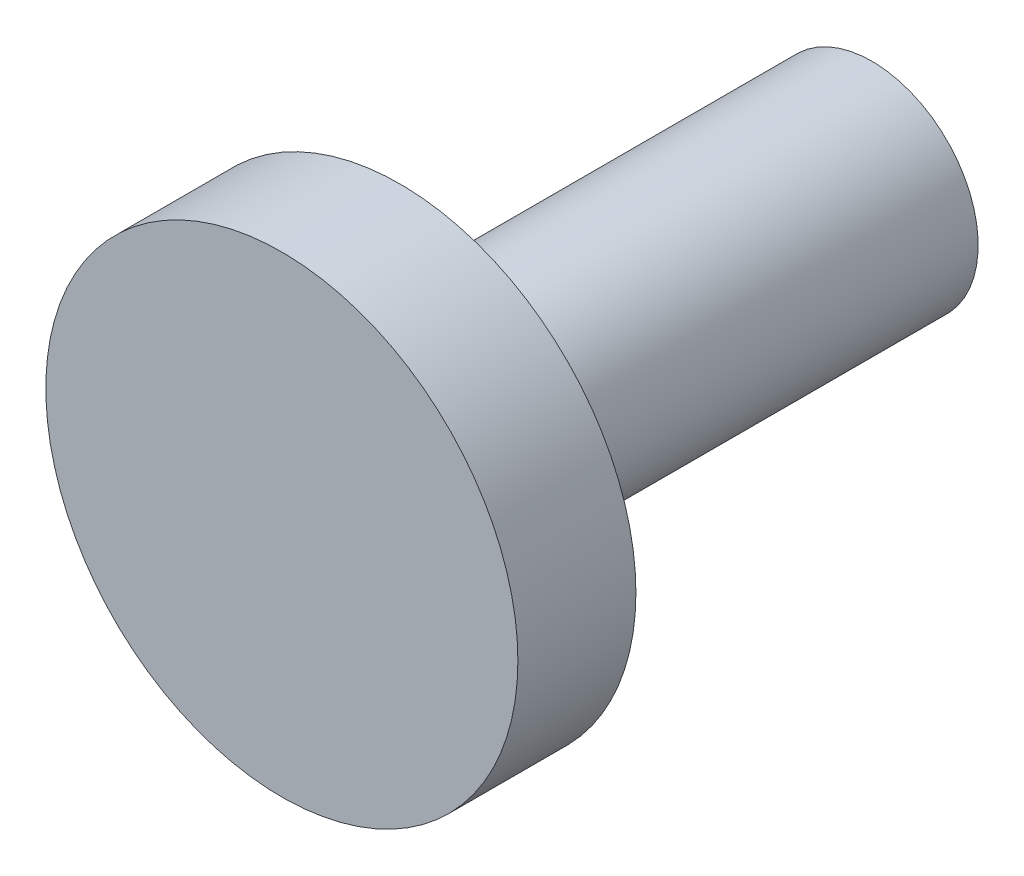
ISO-10303-21;
HEADER;
FILE_DESCRIPTION(('STEP AP214'),'2;1');
FILE_NAME('part.step','',(''),(''),'','','');
FILE_SCHEMA(('AUTOMOTIVE_DESIGN { 1 0 10303 214 1 1 1 1 }'));
ENDSEC;
DATA;
#1=APPLICATION_CONTEXT('core data for automotive mechanical design processes');
#2=APPLICATION_PROTOCOL_DEFINITION('international standard','automotive_design',2000,#1);
#3=PRODUCT_CONTEXT('',#1,'mechanical');
#4=PRODUCT('Part','Part','',(#3));
#5=PRODUCT_RELATED_PRODUCT_CATEGORY('part','',(#4));
#6=PRODUCT_DEFINITION_FORMATION('','',#4);
#7=PRODUCT_DEFINITION_CONTEXT('part definition',#1,'design');
#8=PRODUCT_DEFINITION('design','',#6,#7);
#9=PRODUCT_DEFINITION_SHAPE('','',#8);
#10=(LENGTH_UNIT() NAMED_UNIT(*) SI_UNIT(.MILLI.,.METRE.));
#11=(NAMED_UNIT(*) PLANE_ANGLE_UNIT() SI_UNIT($,.RADIAN.));
#12=(NAMED_UNIT(*) SI_UNIT($,.STERADIAN.) SOLID_ANGLE_UNIT());
#13=UNCERTAINTY_MEASURE_WITH_UNIT(LENGTH_MEASURE(1.E-05),#10,'distance_accuracy_value','');
#14=(GEOMETRIC_REPRESENTATION_CONTEXT(3) GLOBAL_UNCERTAINTY_ASSIGNED_CONTEXT((#13)) GLOBAL_UNIT_ASSIGNED_CONTEXT((#10,
#11,#12)) REPRESENTATION_CONTEXT('',''));
#15=CARTESIAN_POINT('',(0.,0.,0.));
#16=DIRECTION('',(0.,0.,1.));
#17=DIRECTION('',(1.,0.,0.));
#18=AXIS2_PLACEMENT_3D('',#15,#16,#17);
#19=CARTESIAN_POINT('',(0.,0.,2.5));
#20=DIRECTION('',(0.,0.,-1.));
#21=DIRECTION('',(-1.,0.,0.));
#22=AXIS2_PLACEMENT_3D('',#19,#20,#21);
#23=CYLINDRICAL_SURFACE('',#22,5.);
#24=CARTESIAN_POINT('',(0.,0.,2.5));
#25=DIRECTION('',(0.,0.,1.));
#26=DIRECTION('',(1.,0.,0.));
#27=AXIS2_PLACEMENT_3D('',#24,#25,#26);
#28=CIRCLE('',#27,5.);
#29=CARTESIAN_POINT('',(5.,0.,2.5));
#30=VERTEX_POINT('',#29);
#31=EDGE_CURVE('E40',#30,#30,#28,.T.);
#32=ORIENTED_EDGE('',*,*,#31,.F.);
#33=EDGE_LOOP('',(#32));
#34=FACE_BOUND('',#33,.T.);
#35=CARTESIAN_POINT('',(0.,0.,0.));
#36=DIRECTION('',(0.,0.,1.));
#37=DIRECTION('',(1.,0.,0.));
#38=AXIS2_PLACEMENT_3D('',#35,#36,#37);
#39=CIRCLE('',#38,5.);
#40=CARTESIAN_POINT('',(5.,0.,0.));
#41=VERTEX_POINT('',#40);
#42=EDGE_CURVE('E36',#41,#41,#39,.T.);
#43=ORIENTED_EDGE('',*,*,#42,.T.);
#44=EDGE_LOOP('',(#43));
#45=FACE_BOUND('',#44,.T.);
#46=ADVANCED_FACE('F33',(#34,#45),#23,.T.);
#47=CARTESIAN_POINT('',(0.,0.,2.5));
#48=DIRECTION('',(0.,0.,1.));
#49=DIRECTION('',(1.,0.,0.));
#50=AXIS2_PLACEMENT_3D('',#47,#48,#49);
#51=PLANE('',#50);
#52=ORIENTED_EDGE('',*,*,#31,.T.);
#53=EDGE_LOOP('',(#52));
#54=FACE_BOUND('',#53,.T.);
#55=ADVANCED_FACE('F77',(#54),#51,.T.);
#56=CARTESIAN_POINT('',(0.,0.,0.));
#57=DIRECTION('',(0.,0.,1.));
#58=DIRECTION('',(1.,0.,0.));
#59=AXIS2_PLACEMENT_3D('',#56,#57,#58);
#60=PLANE('',#59);
#61=CARTESIAN_POINT('',(0.,0.,0.));
#62=DIRECTION('',(0.,0.,-1.));
#63=DIRECTION('',(-1.,0.,0.));
#64=AXIS2_PLACEMENT_3D('',#61,#62,#63);
#65=CIRCLE('',#64,2.25);
#66=CARTESIAN_POINT('',(-2.25,0.,0.));
#67=VERTEX_POINT('',#66);
#68=EDGE_CURVE('E10',#67,#67,#65,.T.);
#69=ORIENTED_EDGE('',*,*,#68,.F.);
#70=EDGE_LOOP('',(#69));
#71=FACE_BOUND('',#70,.T.);
#72=ORIENTED_EDGE('',*,*,#42,.F.);
#73=EDGE_LOOP('',(#72));
#74=FACE_BOUND('',#73,.T.);
#75=ADVANCED_FACE('F72',(#71,#74),#60,.F.);
#76=CARTESIAN_POINT('',(0.,0.,-10.));
#77=DIRECTION('',(0.,0.,1.));
#78=DIRECTION('',(1.,0.,0.));
#79=AXIS2_PLACEMENT_3D('',#76,#77,#78);
#80=CYLINDRICAL_SURFACE('',#79,2.25);
#81=CARTESIAN_POINT('',(0.,0.,-10.));
#82=DIRECTION('',(0.,0.,-1.));
#83=DIRECTION('',(-1.,0.,0.));
#84=AXIS2_PLACEMENT_3D('',#81,#82,#83);
#85=CIRCLE('',#84,2.25);
#86=CARTESIAN_POINT('',(-2.25,0.,-10.));
#87=VERTEX_POINT('',#86);
#88=EDGE_CURVE('E46',#87,#87,#85,.T.);
#89=ORIENTED_EDGE('',*,*,#88,.F.);
#90=EDGE_LOOP('',(#89));
#91=FACE_BOUND('',#90,.T.);
#92=ORIENTED_EDGE('',*,*,#68,.T.);
#93=EDGE_LOOP('',(#92));
#94=FACE_BOUND('',#93,.T.);
#95=ADVANCED_FACE('F67',(#91,#94),#80,.T.);
#96=CARTESIAN_POINT('',(0.,0.,-10.));
#97=DIRECTION('',(0.,0.,-1.));
#98=DIRECTION('',(-1.,0.,0.));
#99=AXIS2_PLACEMENT_3D('',#96,#97,#98);
#100=PLANE('',#99);
#101=CARTESIAN_POINT('',(0.,0.,-10.));
#102=DIRECTION('',(0.,0.,-1.));
#103=DIRECTION('',(-1.,0.,0.));
#104=AXIS2_PLACEMENT_3D('',#101,#102,#103);
#105=CIRCLE('',#104,1.25);
#106=CARTESIAN_POINT('',(-1.25,0.,-10.));
#107=VERTEX_POINT('',#106);
#108=EDGE_CURVE('E50',#107,#107,#105,.T.);
#109=ORIENTED_EDGE('',*,*,#108,.F.);
#110=EDGE_LOOP('',(#109));
#111=FACE_BOUND('',#110,.T.);
#112=ORIENTED_EDGE('',*,*,#88,.T.);
#113=EDGE_LOOP('',(#112));
#114=FACE_BOUND('',#113,.T.);
#115=ADVANCED_FACE('F61',(#111,#114),#100,.T.);
#116=CARTESIAN_POINT('',(0.,0.,0.));
#117=DIRECTION('',(0.,0.,-1.));
#118=DIRECTION('',(-1.,0.,0.));
#119=AXIS2_PLACEMENT_3D('',#116,#117,#118);
#120=CYLINDRICAL_SURFACE('',#119,1.25);
#121=CARTESIAN_POINT('',(0.,0.,0.));
#122=DIRECTION('',(0.,0.,-1.));
#123=DIRECTION('',(-1.,0.,0.));
#124=AXIS2_PLACEMENT_3D('',#121,#122,#123);
#125=CIRCLE('',#124,1.25);
#126=CARTESIAN_POINT('',(-1.25,0.,0.));
#127=VERTEX_POINT('',#126);
#128=EDGE_CURVE('E49',#127,#127,#125,.T.);
#129=ORIENTED_EDGE('',*,*,#128,.F.);
#130=EDGE_LOOP('',(#129));
#131=FACE_BOUND('',#130,.T.);
#132=ORIENTED_EDGE('',*,*,#108,.T.);
#133=EDGE_LOOP('',(#132));
#134=FACE_BOUND('',#133,.T.);
#135=ADVANCED_FACE('F58',(#131,#134),#120,.F.);
#136=CARTESIAN_POINT('',(0.,0.,0.));
#137=DIRECTION('',(0.,0.,-1.));
#138=DIRECTION('',(-1.,0.,0.));
#139=AXIS2_PLACEMENT_3D('',#136,#137,#138);
#140=PLANE('',#139);
#141=ORIENTED_EDGE('',*,*,#128,.T.);
#142=EDGE_LOOP('',(#141));
#143=FACE_BOUND('',#142,.T.);
#144=ADVANCED_FACE('F56',(#143),#140,.T.);
#145=CLOSED_SHELL('',(#46,#55,#75,#95,#115,#135,#144));
#146=MANIFOLD_SOLID_BREP('B2',#145);
#147=ADVANCED_BREP_SHAPE_REPRESENTATION('',(#18,#146),#14);
#148=SHAPE_DEFINITION_REPRESENTATION(#9,#147);
ENDSEC;
END-ISO-10303-21;
